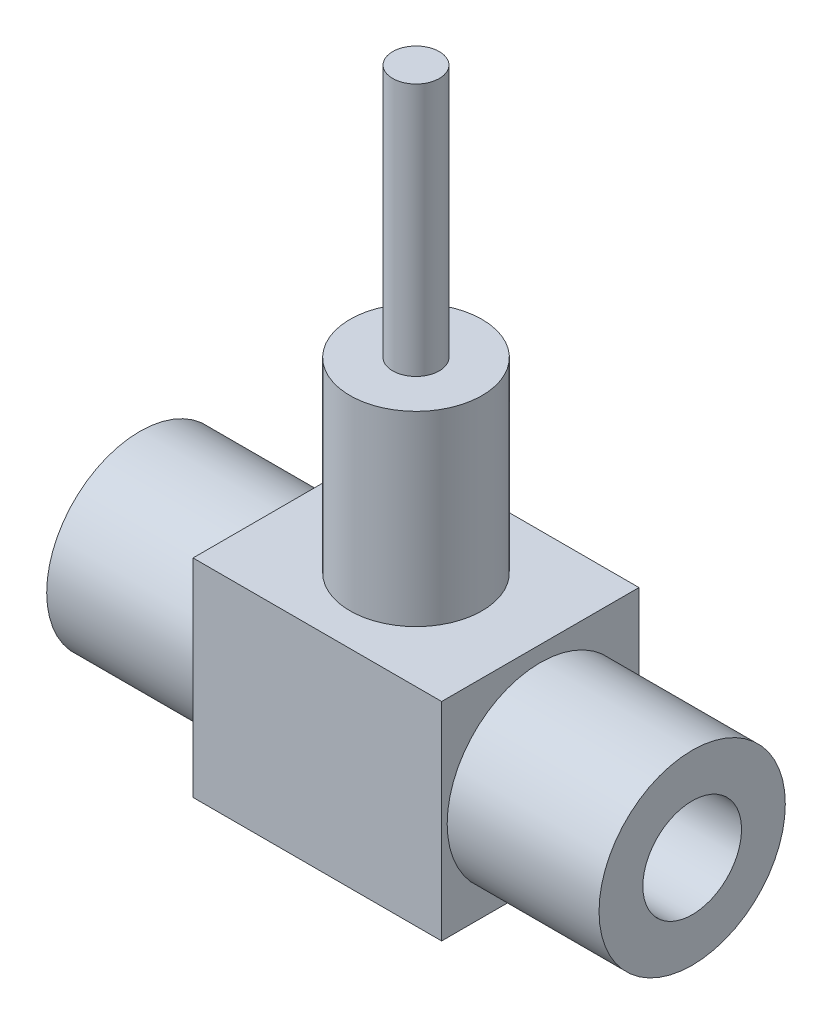
ISO-10303-21;
HEADER;
FILE_DESCRIPTION(('STEP AP214'),'2;1');
FILE_NAME('part.step','',(''),(''),'','','');
FILE_SCHEMA(('AUTOMOTIVE_DESIGN { 1 0 10303 214 1 1 1 1 }'));
ENDSEC;
DATA;
#1=APPLICATION_CONTEXT('core data for automotive mechanical design processes');
#2=APPLICATION_PROTOCOL_DEFINITION('international standard','automotive_design',2000,#1);
#3=PRODUCT_CONTEXT('',#1,'mechanical');
#4=PRODUCT('Part','Part','',(#3));
#5=PRODUCT_RELATED_PRODUCT_CATEGORY('part','',(#4));
#6=PRODUCT_DEFINITION_FORMATION('','',#4);
#7=PRODUCT_DEFINITION_CONTEXT('part definition',#1,'design');
#8=PRODUCT_DEFINITION('design','',#6,#7);
#9=PRODUCT_DEFINITION_SHAPE('','',#8);
#10=(LENGTH_UNIT() NAMED_UNIT(*) SI_UNIT(.MILLI.,.METRE.));
#11=(NAMED_UNIT(*) PLANE_ANGLE_UNIT() SI_UNIT($,.RADIAN.));
#12=(NAMED_UNIT(*) SI_UNIT($,.STERADIAN.) SOLID_ANGLE_UNIT());
#13=UNCERTAINTY_MEASURE_WITH_UNIT(LENGTH_MEASURE(1.E-05),#10,'distance_accuracy_value','');
#14=(GEOMETRIC_REPRESENTATION_CONTEXT(3) GLOBAL_UNCERTAINTY_ASSIGNED_CONTEXT((#13)) GLOBAL_UNIT_ASSIGNED_CONTEXT((#10,
#11,#12)) REPRESENTATION_CONTEXT('',''));
#15=CARTESIAN_POINT('',(0.,0.,0.));
#16=DIRECTION('',(0.,0.,1.));
#17=DIRECTION('',(1.,0.,0.));
#18=AXIS2_PLACEMENT_3D('',#15,#16,#17);
#19=CARTESIAN_POINT('',(-16.,14.,12.7));
#20=DIRECTION('',(1.,0.,0.));
#21=DIRECTION('',(0.,0.,-1.));
#22=AXIS2_PLACEMENT_3D('',#19,#20,#21);
#23=PLANE('',#22);
#24=CARTESIAN_POINT('',(-16.,0.,0.));
#25=DIRECTION('',(-1.,0.,0.));
#26=DIRECTION('',(0.,0.,1.));
#27=AXIS2_PLACEMENT_3D('',#24,#25,#26);
#28=CIRCLE('',#27,11.988);
#29=CARTESIAN_POINT('',(-16.,0.,11.988));
#30=VERTEX_POINT('',#29);
#31=EDGE_CURVE('E11',#30,#30,#28,.T.);
#32=ORIENTED_EDGE('',*,*,#31,.F.);
#33=EDGE_LOOP('',(#32));
#34=FACE_BOUND('',#33,.T.);
#35=DIRECTION('',(0.,-1.,0.));
#36=VECTOR('',#35,1.);
#37=CARTESIAN_POINT('',(-16.,14.,-12.7));
#38=LINE('',#37,#36);
#39=CARTESIAN_POINT('',(-16.,14.,-12.7));
#40=VERTEX_POINT('',#39);
#41=CARTESIAN_POINT('',(-16.,-12.7,-12.7));
#42=VERTEX_POINT('',#41);
#43=EDGE_CURVE('E107',#40,#42,#38,.T.);
#44=ORIENTED_EDGE('',*,*,#43,.T.);
#45=DIRECTION('',(0.,0.,-1.));
#46=VECTOR('',#45,1.);
#47=CARTESIAN_POINT('',(-16.,-12.7,12.7));
#48=LINE('',#47,#46);
#49=CARTESIAN_POINT('',(-16.,-12.7,12.7));
#50=VERTEX_POINT('',#49);
#51=EDGE_CURVE('E49',#50,#42,#48,.T.);
#52=ORIENTED_EDGE('',*,*,#51,.F.);
#53=DIRECTION('',(0.,-1.,0.));
#54=VECTOR('',#53,1.);
#55=CARTESIAN_POINT('',(-16.,14.,12.7));
#56=LINE('',#55,#54);
#57=CARTESIAN_POINT('',(-16.,14.,12.7));
#58=VERTEX_POINT('',#57);
#59=EDGE_CURVE('E91',#58,#50,#56,.T.);
#60=ORIENTED_EDGE('',*,*,#59,.F.);
#61=DIRECTION('',(0.,0.,-1.));
#62=VECTOR('',#61,1.);
#63=CARTESIAN_POINT('',(-16.,14.,12.7));
#64=LINE('',#63,#62);
#65=EDGE_CURVE('E102',#58,#40,#64,.T.);
#66=ORIENTED_EDGE('',*,*,#65,.T.);
#67=EDGE_LOOP('',(#44,#52,#60,#66));
#68=FACE_BOUND('',#67,.T.);
#69=ADVANCED_FACE('F41',(#34,#68),#23,.F.);
#70=CARTESIAN_POINT('',(-16.,-12.7,12.7));
#71=DIRECTION('',(0.,1.,0.));
#72=DIRECTION('',(0.,0.,1.));
#73=AXIS2_PLACEMENT_3D('',#70,#71,#72);
#74=PLANE('',#73);
#75=DIRECTION('',(1.,0.,0.));
#76=VECTOR('',#75,1.);
#77=CARTESIAN_POINT('',(-16.,-12.7,-12.7));
#78=LINE('',#77,#76);
#79=CARTESIAN_POINT('',(16.,-12.7,-12.7));
#80=VERTEX_POINT('',#79);
#81=EDGE_CURVE('E99',#42,#80,#78,.T.);
#82=ORIENTED_EDGE('',*,*,#81,.T.);
#83=DIRECTION('',(0.,0.,-1.));
#84=VECTOR('',#83,1.);
#85=CARTESIAN_POINT('',(16.,-12.7,12.7));
#86=LINE('',#85,#84);
#87=CARTESIAN_POINT('',(16.,-12.7,12.7));
#88=VERTEX_POINT('',#87);
#89=EDGE_CURVE('E96',#88,#80,#86,.T.);
#90=ORIENTED_EDGE('',*,*,#89,.F.);
#91=DIRECTION('',(1.,0.,0.));
#92=VECTOR('',#91,1.);
#93=CARTESIAN_POINT('',(-16.,-12.7,12.7));
#94=LINE('',#93,#92);
#95=EDGE_CURVE('E90',#50,#88,#94,.T.);
#96=ORIENTED_EDGE('',*,*,#95,.F.);
#97=ORIENTED_EDGE('',*,*,#51,.T.);
#98=EDGE_LOOP('',(#82,#90,#96,#97));
#99=FACE_BOUND('',#98,.T.);
#100=ADVANCED_FACE('F100',(#99),#74,.F.);
#101=CARTESIAN_POINT('',(16.,-12.7,12.7));
#102=DIRECTION('',(-1.,0.,0.));
#103=DIRECTION('',(0.,0.,1.));
#104=AXIS2_PLACEMENT_3D('',#101,#102,#103);
#105=PLANE('',#104);
#106=CARTESIAN_POINT('',(16.,0.,0.));
#107=DIRECTION('',(-1.,0.,0.));
#108=DIRECTION('',(0.,0.,1.));
#109=AXIS2_PLACEMENT_3D('',#106,#107,#108);
#110=CIRCLE('',#109,11.988);
#111=CARTESIAN_POINT('',(16.,0.,11.988));
#112=VERTEX_POINT('',#111);
#113=EDGE_CURVE('E142',#112,#112,#110,.T.);
#114=ORIENTED_EDGE('',*,*,#113,.T.);
#115=EDGE_LOOP('',(#114));
#116=FACE_BOUND('',#115,.T.);
#117=DIRECTION('',(0.,1.,0.));
#118=VECTOR('',#117,1.);
#119=CARTESIAN_POINT('',(16.,-12.7,-12.7));
#120=LINE('',#119,#118);
#121=CARTESIAN_POINT('',(16.,14.,-12.7));
#122=VERTEX_POINT('',#121);
#123=EDGE_CURVE('E77',#80,#122,#120,.T.);
#124=ORIENTED_EDGE('',*,*,#123,.T.);
#125=DIRECTION('',(0.,0.,-1.));
#126=VECTOR('',#125,1.);
#127=CARTESIAN_POINT('',(16.,14.,12.7));
#128=LINE('',#127,#126);
#129=CARTESIAN_POINT('',(16.,14.,12.7));
#130=VERTEX_POINT('',#129);
#131=EDGE_CURVE('E103',#130,#122,#128,.T.);
#132=ORIENTED_EDGE('',*,*,#131,.F.);
#133=DIRECTION('',(0.,1.,0.));
#134=VECTOR('',#133,1.);
#135=CARTESIAN_POINT('',(16.,-12.7,12.7));
#136=LINE('',#135,#134);
#137=EDGE_CURVE('E93',#88,#130,#136,.T.);
#138=ORIENTED_EDGE('',*,*,#137,.F.);
#139=ORIENTED_EDGE('',*,*,#89,.T.);
#140=EDGE_LOOP('',(#124,#132,#138,#139));
#141=FACE_BOUND('',#140,.T.);
#142=ADVANCED_FACE('F101',(#116,#141),#105,.F.);
#143=CARTESIAN_POINT('',(16.,14.,12.7));
#144=DIRECTION('',(0.,-1.,0.));
#145=DIRECTION('',(0.,0.,-1.));
#146=AXIS2_PLACEMENT_3D('',#143,#144,#145);
#147=PLANE('',#146);
#148=CARTESIAN_POINT('',(0.,14.,0.));
#149=DIRECTION('',(0.,-1.,0.));
#150=DIRECTION('',(0.,0.,-1.));
#151=AXIS2_PLACEMENT_3D('',#148,#149,#150);
#152=CIRCLE('',#151,8.5);
#153=CARTESIAN_POINT('',(0.,14.,-8.5));
#154=VERTEX_POINT('',#153);
#155=EDGE_CURVE('E131',#154,#154,#152,.T.);
#156=ORIENTED_EDGE('',*,*,#155,.T.);
#157=EDGE_LOOP('',(#156));
#158=FACE_BOUND('',#157,.T.);
#159=DIRECTION('',(-1.,0.,0.));
#160=VECTOR('',#159,1.);
#161=CARTESIAN_POINT('',(16.,14.,-12.7));
#162=LINE('',#161,#160);
#163=EDGE_CURVE('E85',#122,#40,#162,.T.);
#164=ORIENTED_EDGE('',*,*,#163,.T.);
#165=ORIENTED_EDGE('',*,*,#65,.F.);
#166=DIRECTION('',(-1.,0.,0.));
#167=VECTOR('',#166,1.);
#168=CARTESIAN_POINT('',(16.,14.,12.7));
#169=LINE('',#168,#167);
#170=EDGE_CURVE('E56',#130,#58,#169,.T.);
#171=ORIENTED_EDGE('',*,*,#170,.F.);
#172=ORIENTED_EDGE('',*,*,#131,.T.);
#173=EDGE_LOOP('',(#164,#165,#171,#172));
#174=FACE_BOUND('',#173,.T.);
#175=ADVANCED_FACE('F180',(#158,#174),#147,.F.);
#176=CARTESIAN_POINT('',(0.,0.,12.7));
#177=DIRECTION('',(0.,0.,1.));
#178=DIRECTION('',(1.,0.,0.));
#179=AXIS2_PLACEMENT_3D('',#176,#177,#178);
#180=PLANE('',#179);
#181=ORIENTED_EDGE('',*,*,#59,.T.);
#182=ORIENTED_EDGE('',*,*,#95,.T.);
#183=ORIENTED_EDGE('',*,*,#137,.T.);
#184=ORIENTED_EDGE('',*,*,#170,.T.);
#185=EDGE_LOOP('',(#181,#182,#183,#184));
#186=FACE_BOUND('',#185,.T.);
#187=ADVANCED_FACE('F92',(#186),#180,.T.);
#188=CARTESIAN_POINT('',(0.,0.,-12.7));
#189=DIRECTION('',(0.,0.,1.));
#190=DIRECTION('',(1.,0.,0.));
#191=AXIS2_PLACEMENT_3D('',#188,#189,#190);
#192=PLANE('',#191);
#193=CARTESIAN_POINT('',(-8.,0.,-12.7));
#194=DIRECTION('',(0.,0.,1.));
#195=DIRECTION('',(1.,0.,0.));
#196=AXIS2_PLACEMENT_3D('',#193,#194,#195);
#197=CIRCLE('',#196,3.5);
#198=CARTESIAN_POINT('',(-11.5,0.,-12.7));
#199=VERTEX_POINT('',#198);
#200=EDGE_CURVE('E319',#199,#199,#197,.T.);
#201=ORIENTED_EDGE('',*,*,#200,.T.);
#202=EDGE_LOOP('',(#201));
#203=FACE_BOUND('',#202,.T.);
#204=ORIENTED_EDGE('',*,*,#43,.F.);
#205=ORIENTED_EDGE('',*,*,#163,.F.);
#206=ORIENTED_EDGE('',*,*,#123,.F.);
#207=ORIENTED_EDGE('',*,*,#81,.F.);
#208=EDGE_LOOP('',(#204,#205,#206,#207));
#209=FACE_BOUND('',#208,.T.);
#210=ADVANCED_FACE('F152',(#203,#209),#192,.F.);
#211=CARTESIAN_POINT('',(35.55,0.,0.));
#212=DIRECTION('',(-1.,0.,0.));
#213=DIRECTION('',(0.,0.,1.));
#214=AXIS2_PLACEMENT_3D('',#211,#212,#213);
#215=PLANE('',#214);
#216=CARTESIAN_POINT('',(35.55,0.,0.));
#217=DIRECTION('',(-1.,0.,0.));
#218=DIRECTION('',(0.,0.,1.));
#219=AXIS2_PLACEMENT_3D('',#216,#217,#218);
#220=CIRCLE('',#219,6.35);
#221=CARTESIAN_POINT('',(35.55,0.,6.35));
#222=VERTEX_POINT('',#221);
#223=EDGE_CURVE('E118',#222,#222,#220,.F.);
#224=ORIENTED_EDGE('',*,*,#223,.F.);
#225=EDGE_LOOP('',(#224));
#226=FACE_BOUND('',#225,.T.);
#227=CARTESIAN_POINT('',(35.55,0.,0.));
#228=DIRECTION('',(-1.,0.,0.));
#229=DIRECTION('',(0.,0.,1.));
#230=AXIS2_PLACEMENT_3D('',#227,#228,#229);
#231=CIRCLE('',#230,11.988);
#232=CARTESIAN_POINT('',(35.55,0.,11.988));
#233=VERTEX_POINT('',#232);
#234=EDGE_CURVE('E115',#233,#233,#231,.T.);
#235=ORIENTED_EDGE('',*,*,#234,.F.);
#236=EDGE_LOOP('',(#235));
#237=FACE_BOUND('',#236,.T.);
#238=ADVANCED_FACE('F149',(#226,#237),#215,.F.);
#239=CARTESIAN_POINT('',(-1000.,0.,0.));
#240=DIRECTION('',(-1.,0.,0.));
#241=DIRECTION('',(0.,0.,1.));
#242=AXIS2_PLACEMENT_3D('',#239,#240,#241);
#243=CYLINDRICAL_SURFACE('',#242,11.988);
#244=ORIENTED_EDGE('',*,*,#113,.F.);
#245=EDGE_LOOP('',(#244));
#246=FACE_BOUND('',#245,.T.);
#247=ORIENTED_EDGE('',*,*,#234,.T.);
#248=EDGE_LOOP('',(#247));
#249=FACE_BOUND('',#248,.T.);
#250=ADVANCED_FACE('F147',(#246,#249),#243,.T.);
#251=CARTESIAN_POINT('',(-35.55,11.988,0.));
#252=DIRECTION('',(1.,0.,0.));
#253=DIRECTION('',(0.,0.,-1.));
#254=AXIS2_PLACEMENT_3D('',#251,#252,#253);
#255=PLANE('',#254);
#256=CARTESIAN_POINT('',(-35.55,0.,0.));
#257=DIRECTION('',(1.,0.,0.));
#258=DIRECTION('',(0.,0.,-1.));
#259=AXIS2_PLACEMENT_3D('',#256,#257,#258);
#260=CIRCLE('',#259,6.35);
#261=CARTESIAN_POINT('',(-35.55,0.,-6.35));
#262=VERTEX_POINT('',#261);
#263=EDGE_CURVE('E124',#262,#262,#260,.F.);
#264=ORIENTED_EDGE('',*,*,#263,.F.);
#265=EDGE_LOOP('',(#264));
#266=FACE_BOUND('',#265,.T.);
#267=CARTESIAN_POINT('',(-35.55,0.,0.));
#268=DIRECTION('',(-1.,0.,0.));
#269=DIRECTION('',(0.,0.,1.));
#270=AXIS2_PLACEMENT_3D('',#267,#268,#269);
#271=CIRCLE('',#270,11.988);
#272=CARTESIAN_POINT('',(-35.55,0.,11.988));
#273=VERTEX_POINT('',#272);
#274=EDGE_CURVE('E122',#273,#273,#271,.T.);
#275=ORIENTED_EDGE('',*,*,#274,.T.);
#276=EDGE_LOOP('',(#275));
#277=FACE_BOUND('',#276,.T.);
#278=ADVANCED_FACE('F156',(#266,#277),#255,.F.);
#279=CARTESIAN_POINT('',(-1000.,0.,0.));
#280=DIRECTION('',(-1.,0.,0.));
#281=DIRECTION('',(0.,0.,1.));
#282=AXIS2_PLACEMENT_3D('',#279,#280,#281);
#283=CYLINDRICAL_SURFACE('',#282,11.988);
#284=ORIENTED_EDGE('',*,*,#274,.F.);
#285=EDGE_LOOP('',(#284));
#286=FACE_BOUND('',#285,.T.);
#287=ORIENTED_EDGE('',*,*,#31,.T.);
#288=EDGE_LOOP('',(#287));
#289=FACE_BOUND('',#288,.T.);
#290=ADVANCED_FACE('F212',(#286,#289),#283,.T.);
#291=CARTESIAN_POINT('',(-1000.,0.,0.));
#292=DIRECTION('',(-1.,0.,0.));
#293=DIRECTION('',(0.,0.,1.));
#294=AXIS2_PLACEMENT_3D('',#291,#292,#293);
#295=CYLINDRICAL_SURFACE('',#294,6.35);
#296=CARTESIAN_POINT('',(12.6500000000001,0.,0.));
#297=DIRECTION('',(-1.,0.,0.));
#298=DIRECTION('',(0.,0.,1.));
#299=AXIS2_PLACEMENT_3D('',#296,#297,#298);
#300=CIRCLE('',#299,6.35);
#301=CARTESIAN_POINT('',(12.6500000000001,0.,6.35));
#302=VERTEX_POINT('',#301);
#303=EDGE_CURVE('E125',#302,#302,#300,.T.);
#304=ORIENTED_EDGE('',*,*,#303,.T.);
#305=EDGE_LOOP('',(#304));
#306=FACE_BOUND('',#305,.T.);
#307=ORIENTED_EDGE('',*,*,#223,.T.);
#308=EDGE_LOOP('',(#307));
#309=FACE_BOUND('',#308,.T.);
#310=ADVANCED_FACE('F211',(#306,#309),#295,.F.);
#311=CARTESIAN_POINT('',(12.65,6.35,0.));
#312=DIRECTION('',(1.,0.,0.));
#313=DIRECTION('',(0.,0.,-1.));
#314=AXIS2_PLACEMENT_3D('',#311,#312,#313);
#315=PLANE('',#314);
#316=ORIENTED_EDGE('',*,*,#303,.F.);
#317=EDGE_LOOP('',(#316));
#318=FACE_BOUND('',#317,.T.);
#319=ADVANCED_FACE('F206',(#318),#315,.T.);
#320=CARTESIAN_POINT('',(-1000.,0.,0.));
#321=DIRECTION('',(-1.,0.,0.));
#322=DIRECTION('',(0.,0.,1.));
#323=AXIS2_PLACEMENT_3D('',#320,#321,#322);
#324=CYLINDRICAL_SURFACE('',#323,6.35);
#325=CARTESIAN_POINT('',(-12.6500000000001,0.,0.));
#326=DIRECTION('',(-1.,0.,0.));
#327=DIRECTION('',(0.,0.,1.));
#328=AXIS2_PLACEMENT_3D('',#325,#326,#327);
#329=CIRCLE('',#328,6.35);
#330=CARTESIAN_POINT('',(-12.6500000000001,0.,6.35));
#331=VERTEX_POINT('',#330);
#332=EDGE_CURVE('E123',#331,#331,#329,.T.);
#333=ORIENTED_EDGE('',*,*,#332,.F.);
#334=EDGE_LOOP('',(#333));
#335=FACE_BOUND('',#334,.T.);
#336=ORIENTED_EDGE('',*,*,#263,.T.);
#337=EDGE_LOOP('',(#336));
#338=FACE_BOUND('',#337,.T.);
#339=ADVANCED_FACE('F205',(#335,#338),#324,.F.);
#340=CARTESIAN_POINT('',(-12.65,0.,0.));
#341=DIRECTION('',(-1.,0.,0.));
#342=DIRECTION('',(0.,0.,1.));
#343=AXIS2_PLACEMENT_3D('',#340,#341,#342);
#344=PLANE('',#343);
#345=ORIENTED_EDGE('',*,*,#332,.T.);
#346=EDGE_LOOP('',(#345));
#347=FACE_BOUND('',#346,.T.);
#348=ADVANCED_FACE('F192',(#347),#344,.T.);
#349=CARTESIAN_POINT('',(0.,-500.,0.));
#350=DIRECTION('',(0.,-1.,0.));
#351=DIRECTION('',(0.,0.,-1.));
#352=AXIS2_PLACEMENT_3D('',#349,#350,#351);
#353=CYLINDRICAL_SURFACE('',#352,8.5);
#354=CARTESIAN_POINT('',(0.,38.,0.));
#355=DIRECTION('',(0.,-1.,0.));
#356=DIRECTION('',(0.,0.,-1.));
#357=AXIS2_PLACEMENT_3D('',#354,#355,#356);
#358=CIRCLE('',#357,8.5);
#359=CARTESIAN_POINT('',(0.,38.,-8.5));
#360=VERTEX_POINT('',#359);
#361=EDGE_CURVE('E137',#360,#360,#358,.T.);
#362=ORIENTED_EDGE('',*,*,#361,.T.);
#363=EDGE_LOOP('',(#362));
#364=FACE_BOUND('',#363,.T.);
#365=ORIENTED_EDGE('',*,*,#155,.F.);
#366=EDGE_LOOP('',(#365));
#367=FACE_BOUND('',#366,.T.);
#368=ADVANCED_FACE('F191',(#364,#367),#353,.T.);
#369=CARTESIAN_POINT('',(8.5,38.,0.));
#370=DIRECTION('',(0.,1.,0.));
#371=DIRECTION('',(0.,0.,1.));
#372=AXIS2_PLACEMENT_3D('',#369,#370,#371);
#373=PLANE('',#372);
#374=CARTESIAN_POINT('',(0.,38.,0.));
#375=DIRECTION('',(0.,-1.,0.));
#376=DIRECTION('',(0.,0.,-1.));
#377=AXIS2_PLACEMENT_3D('',#374,#375,#376);
#378=CIRCLE('',#377,3.);
#379=CARTESIAN_POINT('',(0.,38.,-3.));
#380=VERTEX_POINT('',#379);
#381=EDGE_CURVE('E329',#380,#380,#378,.T.);
#382=ORIENTED_EDGE('',*,*,#381,.T.);
#383=EDGE_LOOP('',(#382));
#384=FACE_BOUND('',#383,.T.);
#385=ORIENTED_EDGE('',*,*,#361,.F.);
#386=EDGE_LOOP('',(#385));
#387=FACE_BOUND('',#386,.T.);
#388=ADVANCED_FACE('F195',(#384,#387),#373,.T.);
#389=CARTESIAN_POINT('',(0.,-500.,0.));
#390=DIRECTION('',(0.,-1.,0.));
#391=DIRECTION('',(0.,0.,-1.));
#392=AXIS2_PLACEMENT_3D('',#389,#390,#391);
#393=CYLINDRICAL_SURFACE('',#392,3.);
#394=CARTESIAN_POINT('',(0.,70.6,0.));
#395=DIRECTION('',(0.,-1.,0.));
#396=DIRECTION('',(0.,0.,-1.));
#397=AXIS2_PLACEMENT_3D('',#394,#395,#396);
#398=CIRCLE('',#397,3.);
#399=CARTESIAN_POINT('',(0.,70.6,-3.));
#400=VERTEX_POINT('',#399);
#401=EDGE_CURVE('E322',#400,#400,#398,.T.);
#402=ORIENTED_EDGE('',*,*,#401,.T.);
#403=EDGE_LOOP('',(#402));
#404=FACE_BOUND('',#403,.T.);
#405=ORIENTED_EDGE('',*,*,#381,.F.);
#406=EDGE_LOOP('',(#405));
#407=FACE_BOUND('',#406,.T.);
#408=ADVANCED_FACE('F198',(#404,#407),#393,.T.);
#409=CARTESIAN_POINT('',(3.,70.6,0.));
#410=DIRECTION('',(0.,1.,0.));
#411=DIRECTION('',(0.,0.,1.));
#412=AXIS2_PLACEMENT_3D('',#409,#410,#411);
#413=PLANE('',#412);
#414=ORIENTED_EDGE('',*,*,#401,.F.);
#415=EDGE_LOOP('',(#414));
#416=FACE_BOUND('',#415,.T.);
#417=ADVANCED_FACE('F261',(#416),#413,.T.);
#418=CARTESIAN_POINT('',(-8.,0.,-4.1));
#419=DIRECTION('',(0.,0.,-1.));
#420=DIRECTION('',(-1.,0.,0.));
#421=AXIS2_PLACEMENT_3D('',#418,#419,#420);
#422=CYLINDRICAL_SURFACE('',#421,3.5);
#423=CARTESIAN_POINT('',(-8.,0.,-4.1));
#424=DIRECTION('',(0.,0.,1.));
#425=DIRECTION('',(1.,0.,0.));
#426=AXIS2_PLACEMENT_3D('',#423,#424,#425);
#427=CIRCLE('',#426,3.5);
#428=CARTESIAN_POINT('',(-11.5,0.,-4.1));
#429=VERTEX_POINT('',#428);
#430=EDGE_CURVE('E318',#429,#429,#427,.T.);
#431=CARTESIAN_POINT('',(-11.5,0.,-4.1));
#432=CARTESIAN_POINT('',(-11.5,0.,-4.18958333333333));
#433=CARTESIAN_POINT('',(-11.5,0.,-4.27916666666667));
#434=CARTESIAN_POINT('',(-11.5,0.,-4.45833333333333));
#435=CARTESIAN_POINT('',(-11.5,0.,-4.54791666666667));
#436=CARTESIAN_POINT('',(-11.5,0.,-4.72708333333333));
#437=CARTESIAN_POINT('',(-11.5,0.,-4.81666666666667));
#438=CARTESIAN_POINT('',(-11.5,0.,-4.99583333333333));
#439=CARTESIAN_POINT('',(-11.5,0.,-5.08541666666667));
#440=CARTESIAN_POINT('',(-11.5,0.,-5.26458333333333));
#441=CARTESIAN_POINT('',(-11.5,0.,-5.35416666666667));
#442=CARTESIAN_POINT('',(-11.5,0.,-5.53333333333333));
#443=CARTESIAN_POINT('',(-11.5,0.,-5.62291666666667));
#444=CARTESIAN_POINT('',(-11.5,0.,-5.80208333333333));
#445=CARTESIAN_POINT('',(-11.5,0.,-5.89166666666667));
#446=CARTESIAN_POINT('',(-11.5,0.,-6.07083333333333));
#447=CARTESIAN_POINT('',(-11.5,0.,-6.16041666666667));
#448=CARTESIAN_POINT('',(-11.5,0.,-6.33958333333333));
#449=CARTESIAN_POINT('',(-11.5,0.,-6.42916666666667));
#450=CARTESIAN_POINT('',(-11.5,0.,-6.60833333333333));
#451=CARTESIAN_POINT('',(-11.5,0.,-6.69791666666667));
#452=CARTESIAN_POINT('',(-11.5,0.,-6.87708333333333));
#453=CARTESIAN_POINT('',(-11.5,0.,-6.96666666666667));
#454=CARTESIAN_POINT('',(-11.5,0.,-7.14583333333333));
#455=CARTESIAN_POINT('',(-11.5,0.,-7.23541666666667));
#456=CARTESIAN_POINT('',(-11.5,0.,-7.41458333333333));
#457=CARTESIAN_POINT('',(-11.5,0.,-7.50416666666667));
#458=CARTESIAN_POINT('',(-11.5,0.,-7.68333333333333));
#459=CARTESIAN_POINT('',(-11.5,0.,-7.77291666666667));
#460=CARTESIAN_POINT('',(-11.5,0.,-7.95208333333334));
#461=CARTESIAN_POINT('',(-11.5,0.,-8.04166666666667));
#462=CARTESIAN_POINT('',(-11.5,0.,-8.22083333333333));
#463=CARTESIAN_POINT('',(-11.5,0.,-8.31041666666667));
#464=CARTESIAN_POINT('',(-11.5,0.,-8.48958333333334));
#465=CARTESIAN_POINT('',(-11.5,0.,-8.57916666666667));
#466=CARTESIAN_POINT('',(-11.5,0.,-8.75833333333333));
#467=CARTESIAN_POINT('',(-11.5,0.,-8.84791666666667));
#468=CARTESIAN_POINT('',(-11.5,0.,-9.02708333333334));
#469=CARTESIAN_POINT('',(-11.5,0.,-9.11666666666667));
#470=CARTESIAN_POINT('',(-11.5,0.,-9.29583333333333));
#471=CARTESIAN_POINT('',(-11.5,0.,-9.38541666666667));
#472=CARTESIAN_POINT('',(-11.5,0.,-9.56458333333333));
#473=CARTESIAN_POINT('',(-11.5,0.,-9.65416666666667));
#474=CARTESIAN_POINT('',(-11.5,0.,-9.83333333333334));
#475=CARTESIAN_POINT('',(-11.5,0.,-9.92291666666667));
#476=CARTESIAN_POINT('',(-11.5,0.,-10.1020833333333));
#477=CARTESIAN_POINT('',(-11.5,0.,-10.1916666666667));
#478=CARTESIAN_POINT('',(-11.5,0.,-10.3708333333333));
#479=CARTESIAN_POINT('',(-11.5,0.,-10.4604166666667));
#480=CARTESIAN_POINT('',(-11.5,0.,-10.6395833333333));
#481=CARTESIAN_POINT('',(-11.5,0.,-10.7291666666667));
#482=CARTESIAN_POINT('',(-11.5,0.,-10.9083333333333));
#483=CARTESIAN_POINT('',(-11.5,0.,-10.9979166666667));
#484=CARTESIAN_POINT('',(-11.5,0.,-11.1770833333333));
#485=CARTESIAN_POINT('',(-11.5,0.,-11.2666666666667));
#486=CARTESIAN_POINT('',(-11.5,0.,-11.4458333333333));
#487=CARTESIAN_POINT('',(-11.5,0.,-11.5354166666667));
#488=CARTESIAN_POINT('',(-11.5,0.,-11.7145833333333));
#489=CARTESIAN_POINT('',(-11.5,0.,-11.8041666666667));
#490=CARTESIAN_POINT('',(-11.5,0.,-11.9833333333333));
#491=CARTESIAN_POINT('',(-11.5,0.,-12.0729166666667));
#492=CARTESIAN_POINT('',(-11.5,0.,-12.2520833333333));
#493=CARTESIAN_POINT('',(-11.5,0.,-12.3416666666667));
#494=CARTESIAN_POINT('',(-11.5,0.,-12.5208333333333));
#495=CARTESIAN_POINT('',(-11.5,0.,-12.6104166666667));
#496=CARTESIAN_POINT('',(-11.5,0.,-12.7));
#497=B_SPLINE_CURVE_WITH_KNOTS('',3,(#431,#432,#433,#434,#435,#436,#437,#438,#439,#440,#441,
#442,#443,#444,#445,#446,#447,#448,#449,#450,#451,#452,#453,#454,#455,#456,#457,#458,#459,#460,
#461,#462,#463,#464,#465,#466,#467,#468,#469,#470,#471,#472,#473,#474,#475,#476,#477,#478,#479,
#480,#481,#482,#483,#484,#485,#486,#487,#488,#489,#490,#491,#492,#493,#494,#495,#496),
.UNSPECIFIED.,.F.,.F.,(4,2,2,2,2,2,2,2,2,2,2,2,2,2,2,2,2,2,2,2,2,2,2,2,2,2,2,2,2,2,2,2,4),(0.,
0.26875,0.5375,0.80625,1.075,1.34375,1.6125,1.88125,2.15,2.41875,2.6875,2.95625,3.225,3.49375,
3.7625,4.03125,4.3,4.56875,4.8375,5.10625,5.375,5.64375,5.9125,6.18125,6.45,6.71875,6.9875,
7.25625,7.525,7.79375,8.0625,8.33125,8.6),.UNSPECIFIED.);
#498=EDGE_CURVE('BSEAM266',#429,#199,#497,.T.);
#499=ORIENTED_EDGE('',*,*,#430,.T.);
#500=ORIENTED_EDGE('',*,*,#200,.F.);
#501=ORIENTED_EDGE('',*,*,#498,.T.);
#502=ORIENTED_EDGE('',*,*,#498,.F.);
#503=EDGE_LOOP('',(#499,#501,#500,#502));
#504=FACE_BOUND('',#503,.T.);
#505=ADVANCED_FACE('F266',(#504),#422,.F.);
#506=CARTESIAN_POINT('',(-8.,0.,-4.1));
#507=DIRECTION('',(0.,0.,1.));
#508=DIRECTION('',(1.,0.,0.));
#509=AXIS2_PLACEMENT_3D('',#506,#507,#508);
#510=PLANE('',#509);
#511=CARTESIAN_POINT('',(-8.,0.,-4.1));
#512=DIRECTION('',(0.,0.,1.));
#513=DIRECTION('',(1.,0.,0.));
#514=AXIS2_PLACEMENT_3D('',#511,#512,#513);
#515=CIRCLE('',#514,1.);
#516=CARTESIAN_POINT('',(-7.,0.,-4.1));
#517=VERTEX_POINT('',#516);
#518=EDGE_CURVE('E42',#517,#517,#515,.F.);
#519=ORIENTED_EDGE('',*,*,#518,.F.);
#520=EDGE_LOOP('',(#519));
#521=FACE_BOUND('',#520,.T.);
#522=ORIENTED_EDGE('',*,*,#430,.F.);
#523=EDGE_LOOP('',(#522));
#524=FACE_BOUND('',#523,.T.);
#525=ADVANCED_FACE('F279',(#521,#524),#510,.F.);
#526=CARTESIAN_POINT('',(-8.,0.,0.));
#527=DIRECTION('',(0.,0.,-1.));
#528=DIRECTION('',(-1.,0.,0.));
#529=AXIS2_PLACEMENT_3D('',#526,#527,#528);
#530=CYLINDRICAL_SURFACE('',#529,1.);
#531=CARTESIAN_POINT('',(-8.,0.,0.));
#532=DIRECTION('',(0.,0.,1.));
#533=DIRECTION('',(1.,0.,0.));
#534=AXIS2_PLACEMENT_3D('',#531,#532,#533);
#535=CIRCLE('',#534,1.);
#536=CARTESIAN_POINT('',(-7.,0.,0.));
#537=VERTEX_POINT('',#536);
#538=EDGE_CURVE('E314',#537,#537,#535,.T.);
#539=ORIENTED_EDGE('',*,*,#538,.T.);
#540=EDGE_LOOP('',(#539));
#541=FACE_BOUND('',#540,.T.);
#542=ORIENTED_EDGE('',*,*,#518,.T.);
#543=EDGE_LOOP('',(#542));
#544=FACE_BOUND('',#543,.T.);
#545=ADVANCED_FACE('F286',(#541,#544),#530,.F.);
#546=CARTESIAN_POINT('',(-8.,0.,0.));
#547=DIRECTION('',(0.,0.,1.));
#548=DIRECTION('',(1.,0.,0.));
#549=AXIS2_PLACEMENT_3D('',#546,#547,#548);
#550=PLANE('',#549);
#551=ORIENTED_EDGE('',*,*,#538,.F.);
#552=EDGE_LOOP('',(#551));
#553=FACE_BOUND('',#552,.T.);
#554=ADVANCED_FACE('F297',(#553),#550,.F.);
#555=CLOSED_SHELL('',(#69,#100,#142,#175,#187,#210,#238,#250,#278,#290,#310,#319,#339,#348,#368,
#388,#408,#417,#505,#525,#545,#554));
#556=MANIFOLD_SOLID_BREP('B2',#555);
#557=ADVANCED_BREP_SHAPE_REPRESENTATION('',(#18,#556),#14);
#558=SHAPE_DEFINITION_REPRESENTATION(#9,#557);
ENDSEC;
END-ISO-10303-21;
